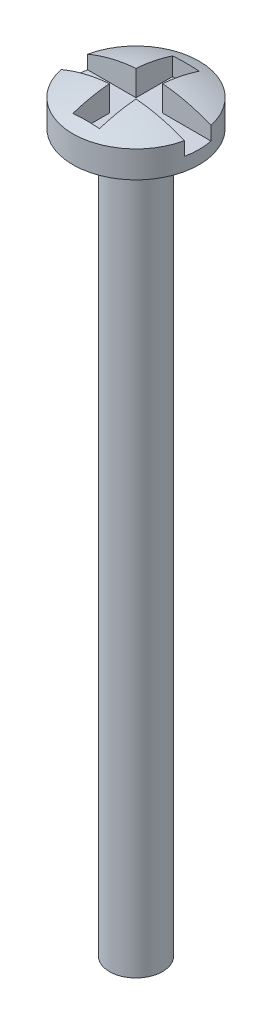
ISO-10303-21;
HEADER;
FILE_DESCRIPTION(('STEP AP214'),'2;1');
FILE_NAME('part.step','',(''),(''),'','','');
FILE_SCHEMA(('AUTOMOTIVE_DESIGN { 1 0 10303 214 1 1 1 1 }'));
ENDSEC;
DATA;
#1=APPLICATION_CONTEXT('core data for automotive mechanical design processes');
#2=APPLICATION_PROTOCOL_DEFINITION('international standard','automotive_design',2000,#1);
#3=PRODUCT_CONTEXT('',#1,'mechanical');
#4=PRODUCT('Part','Part','',(#3));
#5=PRODUCT_RELATED_PRODUCT_CATEGORY('part','',(#4));
#6=PRODUCT_DEFINITION_FORMATION('','',#4);
#7=PRODUCT_DEFINITION_CONTEXT('part definition',#1,'design');
#8=PRODUCT_DEFINITION('design','',#6,#7);
#9=PRODUCT_DEFINITION_SHAPE('','',#8);
#10=(LENGTH_UNIT() NAMED_UNIT(*) SI_UNIT(.MILLI.,.METRE.));
#11=(NAMED_UNIT(*) PLANE_ANGLE_UNIT() SI_UNIT($,.RADIAN.));
#12=(NAMED_UNIT(*) SI_UNIT($,.STERADIAN.) SOLID_ANGLE_UNIT());
#13=UNCERTAINTY_MEASURE_WITH_UNIT(LENGTH_MEASURE(1.E-05),#10,'distance_accuracy_value','');
#14=(GEOMETRIC_REPRESENTATION_CONTEXT(3) GLOBAL_UNCERTAINTY_ASSIGNED_CONTEXT((#13)) GLOBAL_UNIT_ASSIGNED_CONTEXT((#10,
#11,#12)) REPRESENTATION_CONTEXT('',''));
#15=CARTESIAN_POINT('',(0.,0.,0.));
#16=DIRECTION('',(0.,0.,1.));
#17=DIRECTION('',(1.,0.,0.));
#18=AXIS2_PLACEMENT_3D('',#15,#16,#17);
#19=CARTESIAN_POINT('',(-3.50234861591695,27.5,-0.5));
#20=DIRECTION('',(0.,0.,-1.));
#21=DIRECTION('',(-1.,0.,0.));
#22=AXIS2_PLACEMENT_3D('',#19,#20,#21);
#23=PLANE('',#22);
#24=CARTESIAN_POINT('',(0.,22.5,-0.5));
#25=DIRECTION('',(0.,0.,-1.));
#26=DIRECTION('',(-1.,0.,0.));
#27=AXIS2_PLACEMENT_3D('',#24,#25,#26);
#28=CIRCLE('',#27,5.9791303715507);
#29=CARTESIAN_POINT('',(-2.32177195262584,28.0099342101336,-0.5));
#30=VERTEX_POINT('',#29);
#31=CARTESIAN_POINT('',(-0.5,28.4581876439065,-0.5));
#32=VERTEX_POINT('',#31);
#33=EDGE_CURVE('E222',#30,#32,#28,.T.);
#34=ORIENTED_EDGE('',*,*,#33,.F.);
#35=DIRECTION('',(0.,-1.,0.));
#36=VECTOR('',#35,1.);
#37=CARTESIAN_POINT('',(-2.32177195262584,28.5,-0.5));
#38=LINE('',#37,#36);
#39=CARTESIAN_POINT('',(-2.32177195262584,27.5,-0.5));
#40=VERTEX_POINT('',#39);
#41=EDGE_CURVE('E165',#40,#30,#38,.F.);
#42=ORIENTED_EDGE('',*,*,#41,.F.);
#43=DIRECTION('',(-1.,0.,0.));
#44=VECTOR('',#43,1.);
#45=CARTESIAN_POINT('',(-3.50234861591695,27.5,-0.5));
#46=LINE('',#45,#44);
#47=CARTESIAN_POINT('',(-0.5,27.5,-0.5));
#48=VERTEX_POINT('',#47);
#49=EDGE_CURVE('E156',#48,#40,#46,.T.);
#50=ORIENTED_EDGE('',*,*,#49,.F.);
#51=DIRECTION('',(0.,1.,0.));
#52=VECTOR('',#51,1.);
#53=CARTESIAN_POINT('',(-0.5,27.5,-0.5));
#54=LINE('',#53,#52);
#55=EDGE_CURVE('E149',#48,#32,#54,.T.);
#56=ORIENTED_EDGE('',*,*,#55,.T.);
#57=EDGE_LOOP('',(#34,#42,#50,#56));
#58=FACE_BOUND('',#57,.T.);
#59=ADVANCED_FACE('F33',(#58),#23,.F.);
#60=CARTESIAN_POINT('',(-3.50234861591695,27.5,0.5));
#61=DIRECTION('',(0.,0.,1.));
#62=DIRECTION('',(1.,0.,0.));
#63=AXIS2_PLACEMENT_3D('',#60,#61,#62);
#64=PLANE('',#63);
#65=CARTESIAN_POINT('',(0.,22.5,0.5));
#66=DIRECTION('',(0.,0.,1.));
#67=DIRECTION('',(1.,0.,0.));
#68=AXIS2_PLACEMENT_3D('',#65,#66,#67);
#69=CIRCLE('',#68,5.9791303715507);
#70=CARTESIAN_POINT('',(-0.499999999999999,28.4581876439065,0.5));
#71=VERTEX_POINT('',#70);
#72=CARTESIAN_POINT('',(-2.32177195262584,28.0099342101336,0.5));
#73=VERTEX_POINT('',#72);
#74=EDGE_CURVE('E192',#71,#73,#69,.T.);
#75=ORIENTED_EDGE('',*,*,#74,.F.);
#76=DIRECTION('',(0.,-1.,0.));
#77=VECTOR('',#76,1.);
#78=CARTESIAN_POINT('',(-0.5,27.5,0.5));
#79=LINE('',#78,#77);
#80=CARTESIAN_POINT('',(-0.499999999999999,27.5,0.5));
#81=VERTEX_POINT('',#80);
#82=EDGE_CURVE('E41',#71,#81,#79,.T.);
#83=ORIENTED_EDGE('',*,*,#82,.T.);
#84=DIRECTION('',(1.,0.,0.));
#85=VECTOR('',#84,1.);
#86=CARTESIAN_POINT('',(-3.50234861591695,27.5,0.5));
#87=LINE('',#86,#85);
#88=CARTESIAN_POINT('',(-2.32177195262584,27.5,0.5));
#89=VERTEX_POINT('',#88);
#90=EDGE_CURVE('E153',#89,#81,#87,.T.);
#91=ORIENTED_EDGE('',*,*,#90,.F.);
#92=DIRECTION('',(0.,-1.,0.));
#93=VECTOR('',#92,1.);
#94=CARTESIAN_POINT('',(-2.32177195262584,28.5,0.5));
#95=LINE('',#94,#93);
#96=EDGE_CURVE('E163',#73,#89,#95,.T.);
#97=ORIENTED_EDGE('',*,*,#96,.F.);
#98=EDGE_LOOP('',(#75,#83,#91,#97));
#99=FACE_BOUND('',#98,.T.);
#100=ADVANCED_FACE('F190',(#99),#64,.F.);
#101=CARTESIAN_POINT('',(0.,28.5,0.));
#102=DIRECTION('',(0.,-1.,0.));
#103=DIRECTION('',(0.,0.,-1.));
#104=AXIS2_PLACEMENT_3D('',#101,#102,#103);
#105=CYLINDRICAL_SURFACE('',#104,2.375);
#106=CARTESIAN_POINT('',(0.,27.,0.));
#107=DIRECTION('',(0.,1.,0.));
#108=DIRECTION('',(0.,0.,1.));
#109=AXIS2_PLACEMENT_3D('',#106,#107,#108);
#110=CIRCLE('',#109,2.375);
#111=CARTESIAN_POINT('',(0.,27.,2.375));
#112=VERTEX_POINT('',#111);
#113=EDGE_CURVE('E170',#112,#112,#110,.T.);
#114=ORIENTED_EDGE('',*,*,#113,.T.);
#115=EDGE_LOOP('',(#114));
#116=FACE_BOUND('',#115,.T.);
#117=CARTESIAN_POINT('',(0.,28.0099342101336,0.));
#118=DIRECTION('',(0.,-1.,0.));
#119=DIRECTION('',(0.,0.,-1.));
#120=AXIS2_PLACEMENT_3D('',#117,#118,#119);
#121=CIRCLE('',#120,2.375);
#122=CARTESIAN_POINT('',(2.32177195262584,28.0099342101335,0.5));
#123=VERTEX_POINT('',#122);
#124=EDGE_CURVE('E211',#73,#123,#121,.F.);
#125=ORIENTED_EDGE('',*,*,#124,.F.);
#126=ORIENTED_EDGE('',*,*,#96,.T.);
#127=CARTESIAN_POINT('',(0.,27.5,0.));
#128=DIRECTION('',(0.,1.,0.));
#129=DIRECTION('',(0.,0.,1.));
#130=AXIS2_PLACEMENT_3D('',#127,#128,#129);
#131=CIRCLE('',#130,2.375);
#132=EDGE_CURVE('E177',#40,#89,#131,.T.);
#133=ORIENTED_EDGE('',*,*,#132,.F.);
#134=ORIENTED_EDGE('',*,*,#41,.T.);
#135=CARTESIAN_POINT('',(2.32177195262584,28.0099342101335,-0.5));
#136=VERTEX_POINT('',#135);
#137=EDGE_CURVE('E217',#136,#30,#121,.F.);
#138=ORIENTED_EDGE('',*,*,#137,.F.);
#139=DIRECTION('',(0.,-1.,0.));
#140=VECTOR('',#139,1.);
#141=CARTESIAN_POINT('',(2.32177195262584,28.5,-0.5));
#142=LINE('',#141,#140);
#143=CARTESIAN_POINT('',(2.32177195262584,27.5,-0.5));
#144=VERTEX_POINT('',#143);
#145=EDGE_CURVE('E168',#136,#144,#142,.T.);
#146=ORIENTED_EDGE('',*,*,#145,.T.);
#147=CARTESIAN_POINT('',(2.32177195262584,27.5,0.5));
#148=VERTEX_POINT('',#147);
#149=EDGE_CURVE('E182',#148,#144,#131,.T.);
#150=ORIENTED_EDGE('',*,*,#149,.F.);
#151=DIRECTION('',(0.,-1.,0.));
#152=VECTOR('',#151,1.);
#153=CARTESIAN_POINT('',(2.32177195262584,28.5,0.5));
#154=LINE('',#153,#152);
#155=EDGE_CURVE('E160',#148,#123,#154,.F.);
#156=ORIENTED_EDGE('',*,*,#155,.T.);
#157=EDGE_LOOP('',(#125,#126,#133,#134,#138,#146,#150,#156));
#158=FACE_BOUND('',#157,.T.);
#159=ADVANCED_FACE('F209',(#116,#158),#105,.T.);
#160=CARTESIAN_POINT('',(0.,22.5,-0.5));
#161=DIRECTION('',(0.,0.,-1.));
#162=DIRECTION('',(-1.,0.,0.));
#163=AXIS2_PLACEMENT_3D('',#160,#161,#162);
#164=CIRCLE('',#163,5.9791303715507);
#165=CARTESIAN_POINT('',(0.5,28.4581876439065,-0.5));
#166=VERTEX_POINT('',#165);
#167=EDGE_CURVE('E223',#166,#136,#164,.T.);
#168=ORIENTED_EDGE('',*,*,#167,.F.);
#169=DIRECTION('',(0.,-1.,0.));
#170=VECTOR('',#169,1.);
#171=CARTESIAN_POINT('',(0.5,27.5,-0.5));
#172=LINE('',#171,#170);
#173=CARTESIAN_POINT('',(0.5,27.5,-0.5));
#174=VERTEX_POINT('',#173);
#175=EDGE_CURVE('E132',#166,#174,#172,.T.);
#176=ORIENTED_EDGE('',*,*,#175,.T.);
#177=EDGE_CURVE('E157',#144,#174,#46,.T.);
#178=ORIENTED_EDGE('',*,*,#177,.F.);
#179=ORIENTED_EDGE('',*,*,#145,.F.);
#180=EDGE_LOOP('',(#168,#176,#178,#179));
#181=FACE_BOUND('',#180,.T.);
#182=ADVANCED_FACE('F231',(#181),#23,.F.);
#183=CARTESIAN_POINT('',(0.,22.5,0.5));
#184=DIRECTION('',(0.,0.,1.));
#185=DIRECTION('',(1.,0.,0.));
#186=AXIS2_PLACEMENT_3D('',#183,#184,#185);
#187=CIRCLE('',#186,5.9791303715507);
#188=CARTESIAN_POINT('',(0.5,28.4581876439065,0.5));
#189=VERTEX_POINT('',#188);
#190=EDGE_CURVE('E215',#123,#189,#187,.T.);
#191=ORIENTED_EDGE('',*,*,#190,.F.);
#192=ORIENTED_EDGE('',*,*,#155,.F.);
#193=CARTESIAN_POINT('',(0.5,27.5,0.5));
#194=VERTEX_POINT('',#193);
#195=EDGE_CURVE('E152',#194,#148,#87,.T.);
#196=ORIENTED_EDGE('',*,*,#195,.F.);
#197=DIRECTION('',(0.,1.,0.));
#198=VECTOR('',#197,1.);
#199=CARTESIAN_POINT('',(0.5,27.5,0.5));
#200=LINE('',#199,#198);
#201=EDGE_CURVE('E183',#194,#189,#200,.T.);
#202=ORIENTED_EDGE('',*,*,#201,.T.);
#203=EDGE_LOOP('',(#191,#192,#196,#202));
#204=FACE_BOUND('',#203,.T.);
#205=ADVANCED_FACE('F238',(#204),#64,.F.);
#206=CARTESIAN_POINT('',(0.5,27.5,-1.875));
#207=DIRECTION('',(1.,0.,0.));
#208=DIRECTION('',(0.,0.,-1.));
#209=AXIS2_PLACEMENT_3D('',#206,#207,#208);
#210=PLANE('',#209);
#211=CARTESIAN_POINT('',(0.5,22.5,0.));
#212=DIRECTION('',(1.,0.,0.));
#213=DIRECTION('',(0.,0.,-1.));
#214=AXIS2_PLACEMENT_3D('',#211,#212,#213);
#215=CIRCLE('',#214,5.9791303715507);
#216=CARTESIAN_POINT('',(0.499999999999999,28.1775324745879,1.875));
#217=VERTEX_POINT('',#216);
#218=EDGE_CURVE('E48',#189,#217,#215,.T.);
#219=ORIENTED_EDGE('',*,*,#218,.F.);
#220=ORIENTED_EDGE('',*,*,#201,.F.);
#221=DIRECTION('',(0.,0.,-1.));
#222=VECTOR('',#221,1.);
#223=CARTESIAN_POINT('',(0.5,27.5,-1.875));
#224=LINE('',#223,#222);
#225=CARTESIAN_POINT('',(0.499999999999999,27.5,1.875));
#226=VERTEX_POINT('',#225);
#227=EDGE_CURVE('E235',#226,#194,#224,.T.);
#228=ORIENTED_EDGE('',*,*,#227,.F.);
#229=DIRECTION('',(0.,1.,0.));
#230=VECTOR('',#229,1.);
#231=CARTESIAN_POINT('',(0.499999999999999,27.5,1.875));
#232=LINE('',#231,#230);
#233=EDGE_CURVE('E138',#226,#217,#232,.T.);
#234=ORIENTED_EDGE('',*,*,#233,.T.);
#235=EDGE_LOOP('',(#219,#220,#228,#234));
#236=FACE_BOUND('',#235,.T.);
#237=ADVANCED_FACE('F241',(#236),#210,.F.);
#238=CARTESIAN_POINT('',(-0.5,27.5,-1.875));
#239=DIRECTION('',(-1.,0.,0.));
#240=DIRECTION('',(0.,0.,1.));
#241=AXIS2_PLACEMENT_3D('',#238,#239,#240);
#242=PLANE('',#241);
#243=CARTESIAN_POINT('',(-0.5,22.5,0.));
#244=DIRECTION('',(-1.,0.,0.));
#245=DIRECTION('',(0.,0.,1.));
#246=AXIS2_PLACEMENT_3D('',#243,#244,#245);
#247=CIRCLE('',#246,5.9791303715507);
#248=CARTESIAN_POINT('',(-0.499999999999999,28.1775324745879,1.875));
#249=VERTEX_POINT('',#248);
#250=EDGE_CURVE('E242',#249,#71,#247,.T.);
#251=ORIENTED_EDGE('',*,*,#250,.F.);
#252=DIRECTION('',(0.,1.,0.));
#253=VECTOR('',#252,1.);
#254=CARTESIAN_POINT('',(-0.499999999999999,27.5,1.875));
#255=LINE('',#254,#253);
#256=CARTESIAN_POINT('',(-0.499999999999999,27.5,1.875));
#257=VERTEX_POINT('',#256);
#258=EDGE_CURVE('E142',#257,#249,#255,.T.);
#259=ORIENTED_EDGE('',*,*,#258,.F.);
#260=DIRECTION('',(0.,0.,1.));
#261=VECTOR('',#260,1.);
#262=CARTESIAN_POINT('',(-0.5,27.5,-1.875));
#263=LINE('',#262,#261);
#264=EDGE_CURVE('E196',#81,#257,#263,.T.);
#265=ORIENTED_EDGE('',*,*,#264,.F.);
#266=ORIENTED_EDGE('',*,*,#82,.F.);
#267=EDGE_LOOP('',(#251,#259,#265,#266));
#268=FACE_BOUND('',#267,.T.);
#269=ADVANCED_FACE('F197',(#268),#242,.F.);
#270=CARTESIAN_POINT('',(-0.499999999999999,27.5,1.875));
#271=DIRECTION('',(0.,0.,1.));
#272=DIRECTION('',(1.,0.,0.));
#273=AXIS2_PLACEMENT_3D('',#270,#271,#272);
#274=PLANE('',#273);
#275=CARTESIAN_POINT('',(0.,22.5,1.875));
#276=DIRECTION('',(0.,0.,1.));
#277=DIRECTION('',(1.,0.,0.));
#278=AXIS2_PLACEMENT_3D('',#275,#276,#277);
#279=CIRCLE('',#278,5.699506557589);
#280=EDGE_CURVE('E225',#217,#249,#279,.T.);
#281=ORIENTED_EDGE('',*,*,#280,.F.);
#282=ORIENTED_EDGE('',*,*,#233,.F.);
#283=DIRECTION('',(1.,0.,0.));
#284=VECTOR('',#283,1.);
#285=CARTESIAN_POINT('',(-0.499999999999999,27.5,1.875));
#286=LINE('',#285,#284);
#287=EDGE_CURVE('E247',#257,#226,#286,.T.);
#288=ORIENTED_EDGE('',*,*,#287,.F.);
#289=ORIENTED_EDGE('',*,*,#258,.T.);
#290=EDGE_LOOP('',(#281,#282,#288,#289));
#291=FACE_BOUND('',#290,.T.);
#292=ADVANCED_FACE('F296',(#291),#274,.F.);
#293=CARTESIAN_POINT('',(-0.5,22.5,0.));
#294=DIRECTION('',(-1.,0.,0.));
#295=DIRECTION('',(0.,0.,1.));
#296=AXIS2_PLACEMENT_3D('',#293,#294,#295);
#297=CIRCLE('',#296,5.9791303715507);
#298=CARTESIAN_POINT('',(-0.5,28.1775324745879,-1.875));
#299=VERTEX_POINT('',#298);
#300=EDGE_CURVE('E55',#32,#299,#297,.T.);
#301=ORIENTED_EDGE('',*,*,#300,.F.);
#302=ORIENTED_EDGE('',*,*,#55,.F.);
#303=CARTESIAN_POINT('',(-0.5,27.5,-1.875));
#304=VERTEX_POINT('',#303);
#305=EDGE_CURVE('E201',#304,#48,#263,.T.);
#306=ORIENTED_EDGE('',*,*,#305,.F.);
#307=DIRECTION('',(0.,1.,0.));
#308=VECTOR('',#307,1.);
#309=CARTESIAN_POINT('',(-0.5,27.5,-1.875));
#310=LINE('',#309,#308);
#311=EDGE_CURVE('E137',#304,#299,#310,.T.);
#312=ORIENTED_EDGE('',*,*,#311,.T.);
#313=EDGE_LOOP('',(#301,#302,#306,#312));
#314=FACE_BOUND('',#313,.T.);
#315=ADVANCED_FACE('F252',(#314),#242,.F.);
#316=CARTESIAN_POINT('',(0.5,22.5,0.));
#317=DIRECTION('',(1.,0.,0.));
#318=DIRECTION('',(0.,0.,-1.));
#319=AXIS2_PLACEMENT_3D('',#316,#317,#318);
#320=CIRCLE('',#319,5.9791303715507);
#321=CARTESIAN_POINT('',(0.5,28.1775324745879,-1.875));
#322=VERTEX_POINT('',#321);
#323=EDGE_CURVE('E120',#322,#166,#320,.T.);
#324=ORIENTED_EDGE('',*,*,#323,.F.);
#325=DIRECTION('',(0.,1.,0.));
#326=VECTOR('',#325,1.);
#327=CARTESIAN_POINT('',(0.5,27.5,-1.875));
#328=LINE('',#327,#326);
#329=CARTESIAN_POINT('',(0.5,27.5,-1.875));
#330=VERTEX_POINT('',#329);
#331=EDGE_CURVE('E130',#330,#322,#328,.T.);
#332=ORIENTED_EDGE('',*,*,#331,.F.);
#333=EDGE_CURVE('E232',#174,#330,#224,.T.);
#334=ORIENTED_EDGE('',*,*,#333,.F.);
#335=ORIENTED_EDGE('',*,*,#175,.F.);
#336=EDGE_LOOP('',(#324,#332,#334,#335));
#337=FACE_BOUND('',#336,.T.);
#338=ADVANCED_FACE('F128',(#337),#210,.F.);
#339=CARTESIAN_POINT('',(-0.5,27.5,-1.875));
#340=DIRECTION('',(0.,0.,-1.));
#341=DIRECTION('',(-1.,0.,0.));
#342=AXIS2_PLACEMENT_3D('',#339,#340,#341);
#343=PLANE('',#342);
#344=CARTESIAN_POINT('',(0.,22.5,-1.875));
#345=DIRECTION('',(0.,0.,-1.));
#346=DIRECTION('',(-1.,0.,0.));
#347=AXIS2_PLACEMENT_3D('',#344,#345,#346);
#348=CIRCLE('',#347,5.699506557589);
#349=EDGE_CURVE('E11',#299,#322,#348,.T.);
#350=ORIENTED_EDGE('',*,*,#349,.F.);
#351=ORIENTED_EDGE('',*,*,#311,.F.);
#352=DIRECTION('',(-1.,0.,0.));
#353=VECTOR('',#352,1.);
#354=CARTESIAN_POINT('',(-0.5,27.5,-1.875));
#355=LINE('',#354,#353);
#356=EDGE_CURVE('E136',#330,#304,#355,.T.);
#357=ORIENTED_EDGE('',*,*,#356,.F.);
#358=ORIENTED_EDGE('',*,*,#331,.T.);
#359=EDGE_LOOP('',(#350,#351,#357,#358));
#360=FACE_BOUND('',#359,.T.);
#361=ADVANCED_FACE('F134',(#360),#343,.F.);
#362=CARTESIAN_POINT('',(0.,27.,0.));
#363=DIRECTION('',(0.,-1.,0.));
#364=DIRECTION('',(0.,0.,-1.));
#365=AXIS2_PLACEMENT_3D('',#362,#363,#364);
#366=CYLINDRICAL_SURFACE('',#365,1.);
#367=CARTESIAN_POINT('',(0.,27.,0.));
#368=DIRECTION('',(0.,1.,0.));
#369=DIRECTION('',(0.,0.,1.));
#370=AXIS2_PLACEMENT_3D('',#367,#368,#369);
#371=CIRCLE('',#370,1.);
#372=CARTESIAN_POINT('',(0.,27.,1.));
#373=VERTEX_POINT('',#372);
#374=EDGE_CURVE('E174',#373,#373,#371,.T.);
#375=ORIENTED_EDGE('',*,*,#374,.F.);
#376=EDGE_LOOP('',(#375));
#377=FACE_BOUND('',#376,.T.);
#378=CARTESIAN_POINT('',(0.,0.,0.));
#379=DIRECTION('',(0.,1.,0.));
#380=DIRECTION('',(0.,0.,1.));
#381=AXIS2_PLACEMENT_3D('',#378,#379,#380);
#382=CIRCLE('',#381,1.);
#383=CARTESIAN_POINT('',(0.,0.,1.));
#384=VERTEX_POINT('',#383);
#385=EDGE_CURVE('E173',#384,#384,#382,.T.);
#386=ORIENTED_EDGE('',*,*,#385,.T.);
#387=EDGE_LOOP('',(#386));
#388=FACE_BOUND('',#387,.T.);
#389=ADVANCED_FACE('F35',(#377,#388),#366,.T.);
#390=CARTESIAN_POINT('',(0.,0.,0.));
#391=DIRECTION('',(0.,1.,0.));
#392=DIRECTION('',(0.,0.,1.));
#393=AXIS2_PLACEMENT_3D('',#390,#391,#392);
#394=PLANE('',#393);
#395=ORIENTED_EDGE('',*,*,#385,.F.);
#396=EDGE_LOOP('',(#395));
#397=FACE_BOUND('',#396,.T.);
#398=ADVANCED_FACE('F272',(#397),#394,.F.);
#399=CARTESIAN_POINT('',(0.,27.,0.));
#400=DIRECTION('',(0.,1.,0.));
#401=DIRECTION('',(0.,0.,1.));
#402=AXIS2_PLACEMENT_3D('',#399,#400,#401);
#403=PLANE('',#402);
#404=ORIENTED_EDGE('',*,*,#113,.F.);
#405=EDGE_LOOP('',(#404));
#406=FACE_BOUND('',#405,.T.);
#407=ORIENTED_EDGE('',*,*,#374,.T.);
#408=EDGE_LOOP('',(#407));
#409=FACE_BOUND('',#408,.T.);
#410=ADVANCED_FACE('F271',(#406,#409),#403,.F.);
#411=CARTESIAN_POINT('',(-3.50234861591695,27.5,0.5));
#412=DIRECTION('',(0.,1.,0.));
#413=DIRECTION('',(0.,0.,1.));
#414=AXIS2_PLACEMENT_3D('',#411,#412,#413);
#415=PLANE('',#414);
#416=ORIENTED_EDGE('',*,*,#177,.T.);
#417=ORIENTED_EDGE('',*,*,#333,.T.);
#418=ORIENTED_EDGE('',*,*,#356,.T.);
#419=ORIENTED_EDGE('',*,*,#305,.T.);
#420=ORIENTED_EDGE('',*,*,#49,.T.);
#421=ORIENTED_EDGE('',*,*,#132,.T.);
#422=ORIENTED_EDGE('',*,*,#90,.T.);
#423=ORIENTED_EDGE('',*,*,#264,.T.);
#424=ORIENTED_EDGE('',*,*,#287,.T.);
#425=ORIENTED_EDGE('',*,*,#227,.T.);
#426=ORIENTED_EDGE('',*,*,#195,.T.);
#427=ORIENTED_EDGE('',*,*,#149,.T.);
#428=EDGE_LOOP('',(#416,#417,#418,#419,#420,#421,#422,#423,#424,#425,#426,#427));
#429=FACE_BOUND('',#428,.T.);
#430=ADVANCED_FACE('F203',(#429),#415,.T.);
#431=CARTESIAN_POINT('',(0.,22.5,0.));
#432=DIRECTION('',(0.,-1.,0.));
#433=DIRECTION('',(0.,0.,1.));
#434=AXIS2_PLACEMENT_3D('',#431,#432,#433);
#435=SPHERICAL_SURFACE('',#434,6.);
#436=ORIENTED_EDGE('',*,*,#33,.T.);
#437=ORIENTED_EDGE('',*,*,#300,.T.);
#438=ORIENTED_EDGE('',*,*,#349,.T.);
#439=ORIENTED_EDGE('',*,*,#323,.T.);
#440=ORIENTED_EDGE('',*,*,#167,.T.);
#441=ORIENTED_EDGE('',*,*,#137,.T.);
#442=EDGE_LOOP('',(#436,#437,#438,#439,#440,#441));
#443=FACE_BOUND('',#442,.T.);
#444=ADVANCED_FACE('F119',(#443),#435,.T.);
#445=ORIENTED_EDGE('',*,*,#74,.T.);
#446=ORIENTED_EDGE('',*,*,#124,.T.);
#447=ORIENTED_EDGE('',*,*,#190,.T.);
#448=ORIENTED_EDGE('',*,*,#218,.T.);
#449=ORIENTED_EDGE('',*,*,#280,.T.);
#450=ORIENTED_EDGE('',*,*,#250,.T.);
#451=EDGE_LOOP('',(#445,#446,#447,#448,#449,#450));
#452=FACE_BOUND('',#451,.T.);
#453=ADVANCED_FACE('F239',(#452),#435,.T.);
#454=CLOSED_SHELL('',(#59,#100,#159,#182,#205,#237,#269,#292,#315,#338,#361,#389,#398,#410,#430,
#444,#453));
#455=MANIFOLD_SOLID_BREP('B2',#454);
#456=ADVANCED_BREP_SHAPE_REPRESENTATION('',(#18,#455),#14);
#457=SHAPE_DEFINITION_REPRESENTATION(#9,#456);
ENDSEC;
END-ISO-10303-21;
